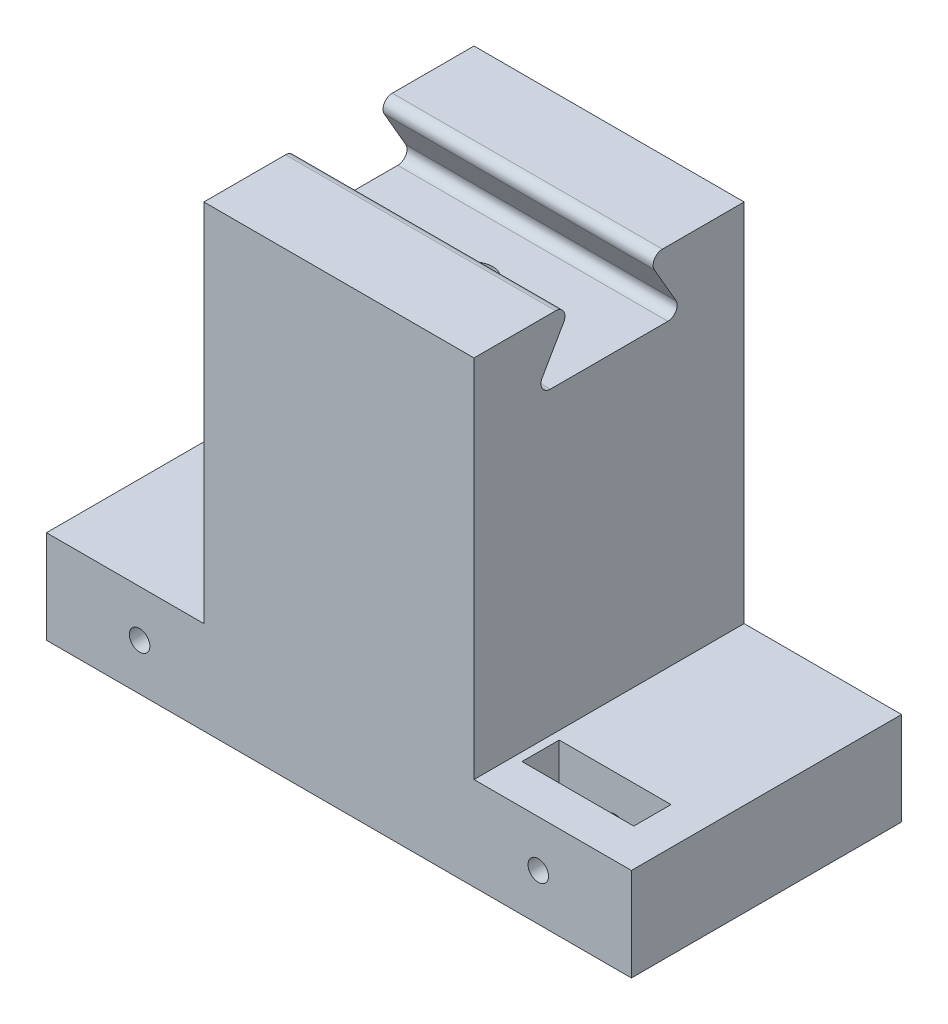
ISO-10303-21;
HEADER;
FILE_DESCRIPTION(('STEP AP214'),'2;1');
FILE_NAME('part.step','',(''),(''),'','','');
FILE_SCHEMA(('AUTOMOTIVE_DESIGN { 1 0 10303 214 1 1 1 1 }'));
ENDSEC;
DATA;
#1=APPLICATION_CONTEXT('core data for automotive mechanical design processes');
#2=APPLICATION_PROTOCOL_DEFINITION('international standard','automotive_design',2000,#1);
#3=PRODUCT_CONTEXT('',#1,'mechanical');
#4=PRODUCT('Part','Part','',(#3));
#5=PRODUCT_RELATED_PRODUCT_CATEGORY('part','',(#4));
#6=PRODUCT_DEFINITION_FORMATION('','',#4);
#7=PRODUCT_DEFINITION_CONTEXT('part definition',#1,'design');
#8=PRODUCT_DEFINITION('design','',#6,#7);
#9=PRODUCT_DEFINITION_SHAPE('','',#8);
#10=(LENGTH_UNIT() NAMED_UNIT(*) SI_UNIT(.MILLI.,.METRE.));
#11=(NAMED_UNIT(*) PLANE_ANGLE_UNIT() SI_UNIT($,.RADIAN.));
#12=(NAMED_UNIT(*) SI_UNIT($,.STERADIAN.) SOLID_ANGLE_UNIT());
#13=UNCERTAINTY_MEASURE_WITH_UNIT(LENGTH_MEASURE(1.E-05),#10,'distance_accuracy_value','');
#14=(GEOMETRIC_REPRESENTATION_CONTEXT(3) GLOBAL_UNCERTAINTY_ASSIGNED_CONTEXT((#13)) GLOBAL_UNIT_ASSIGNED_CONTEXT((#10,
#11,#12)) REPRESENTATION_CONTEXT('',''));
#15=CARTESIAN_POINT('',(0.,0.,0.));
#16=DIRECTION('',(0.,0.,1.));
#17=DIRECTION('',(1.,0.,0.));
#18=AXIS2_PLACEMENT_3D('',#15,#16,#17);
#19=CARTESIAN_POINT('',(-7.25,24.6,7.25));
#20=DIRECTION('',(1.,0.,0.));
#21=DIRECTION('',(0.,0.,-1.));
#22=AXIS2_PLACEMENT_3D('',#19,#20,#21);
#23=PLANE('',#22);
#24=DIRECTION('',(0.,0.,-1.));
#25=VECTOR('',#24,1.);
#26=CARTESIAN_POINT('',(-7.25,5.,0.));
#27=LINE('',#26,#25);
#28=CARTESIAN_POINT('',(-7.25,5.,7.25));
#29=VERTEX_POINT('',#28);
#30=CARTESIAN_POINT('',(-7.25,5.,-7.25));
#31=VERTEX_POINT('',#30);
#32=EDGE_CURVE('E278',#29,#31,#27,.T.);
#33=ORIENTED_EDGE('',*,*,#32,.F.);
#34=DIRECTION('',(0.,-1.,0.));
#35=VECTOR('',#34,1.);
#36=CARTESIAN_POINT('',(-7.25,24.6,7.25));
#37=LINE('',#36,#35);
#38=CARTESIAN_POINT('',(-7.25,24.6,7.25));
#39=VERTEX_POINT('',#38);
#40=EDGE_CURVE('E355',#39,#29,#37,.T.);
#41=ORIENTED_EDGE('',*,*,#40,.F.);
#42=DIRECTION('',(0.,0.,1.));
#43=VECTOR('',#42,1.);
#44=CARTESIAN_POINT('',(-7.25,24.6,7.25));
#45=LINE('',#44,#43);
#46=CARTESIAN_POINT('',(-7.25,24.6,2.86602540378444));
#47=VERTEX_POINT('',#46);
#48=EDGE_CURVE('E343',#47,#39,#45,.T.);
#49=ORIENTED_EDGE('',*,*,#48,.F.);
#50=CARTESIAN_POINT('',(-7.25,24.1,2.86602540378444));
#51=DIRECTION('',(1.,0.,0.));
#52=DIRECTION('',(0.,0.,-1.));
#53=AXIS2_PLACEMENT_3D('',#50,#51,#52);
#54=CIRCLE('',#53,0.5);
#55=CARTESIAN_POINT('',(-7.25,23.85,2.43301270189222));
#56=VERTEX_POINT('',#55);
#57=EDGE_CURVE('E371',#47,#56,#54,.F.);
#58=ORIENTED_EDGE('',*,*,#57,.T.);
#59=DIRECTION('',(0.,-0.86602540378444,0.499999999999998));
#60=VECTOR('',#59,1.);
#61=CARTESIAN_POINT('',(-7.25,22.3266833150659,3.31249999999999));
#62=LINE('',#61,#60);
#63=CARTESIAN_POINT('',(-7.25,21.85,3.58771324027146));
#64=VERTEX_POINT('',#63);
#65=EDGE_CURVE('E316',#56,#64,#62,.T.);
#66=ORIENTED_EDGE('',*,*,#65,.T.);
#67=CARTESIAN_POINT('',(-7.25,21.6,3.15470053837924));
#68=DIRECTION('',(1.,0.,0.));
#69=DIRECTION('',(0.,0.,-1.));
#70=AXIS2_PLACEMENT_3D('',#67,#68,#69);
#71=CIRCLE('',#70,0.5);
#72=CARTESIAN_POINT('',(-7.25,21.1,3.15470053837924));
#73=VERTEX_POINT('',#72);
#74=EDGE_CURVE('E11',#64,#73,#71,.T.);
#75=ORIENTED_EDGE('',*,*,#74,.T.);
#76=DIRECTION('',(0.,0.,-1.));
#77=VECTOR('',#76,1.);
#78=CARTESIAN_POINT('',(-7.25,21.1,7.25));
#79=LINE('',#78,#77);
#80=CARTESIAN_POINT('',(-7.25,21.1,-3.15470053837924));
#81=VERTEX_POINT('',#80);
#82=EDGE_CURVE('E321',#73,#81,#79,.T.);
#83=ORIENTED_EDGE('',*,*,#82,.T.);
#84=CARTESIAN_POINT('',(-7.25,21.6,-3.15470053837924));
#85=DIRECTION('',(1.,0.,0.));
#86=DIRECTION('',(0.,0.,-1.));
#87=AXIS2_PLACEMENT_3D('',#84,#85,#86);
#88=CIRCLE('',#87,0.5);
#89=CARTESIAN_POINT('',(-7.25,21.85,-3.58771324027146));
#90=VERTEX_POINT('',#89);
#91=EDGE_CURVE('E396',#81,#90,#88,.T.);
#92=ORIENTED_EDGE('',*,*,#91,.T.);
#93=DIRECTION('',(0.,0.86602540378444,0.499999999999998));
#94=VECTOR('',#93,1.);
#95=CARTESIAN_POINT('',(-7.25,28.605367492503,0.312499999999984));
#96=LINE('',#95,#94);
#97=CARTESIAN_POINT('',(-7.25,23.85,-2.43301270189221));
#98=VERTEX_POINT('',#97);
#99=EDGE_CURVE('E327',#90,#98,#96,.T.);
#100=ORIENTED_EDGE('',*,*,#99,.T.);
#101=CARTESIAN_POINT('',(-7.25,24.1,-2.86602540378444));
#102=DIRECTION('',(1.,0.,0.));
#103=DIRECTION('',(0.,0.,-1.));
#104=AXIS2_PLACEMENT_3D('',#101,#102,#103);
#105=CIRCLE('',#104,0.5);
#106=CARTESIAN_POINT('',(-7.25,24.6,-2.86602540378443));
#107=VERTEX_POINT('',#106);
#108=EDGE_CURVE('E369',#98,#107,#105,.F.);
#109=ORIENTED_EDGE('',*,*,#108,.T.);
#110=CARTESIAN_POINT('',(-7.25,24.6,-7.25));
#111=VERTEX_POINT('',#110);
#112=EDGE_CURVE('E344',#111,#107,#45,.T.);
#113=ORIENTED_EDGE('',*,*,#112,.F.);
#114=DIRECTION('',(0.,-1.,0.));
#115=VECTOR('',#114,1.);
#116=CARTESIAN_POINT('',(-7.25,24.6,-7.25));
#117=LINE('',#116,#115);
#118=EDGE_CURVE('E358',#111,#31,#117,.T.);
#119=ORIENTED_EDGE('',*,*,#118,.T.);
#120=EDGE_LOOP('',(#33,#41,#49,#58,#66,#75,#83,#92,#100,#109,#113,#119));
#121=FACE_BOUND('',#120,.T.);
#122=ADVANCED_FACE('F34',(#121),#23,.F.);
#123=CARTESIAN_POINT('',(0.,24.6,0.));
#124=DIRECTION('',(0.,-1.,0.));
#125=DIRECTION('',(0.,0.,-1.));
#126=AXIS2_PLACEMENT_3D('',#123,#124,#125);
#127=PLANE('',#126);
#128=ORIENTED_EDGE('',*,*,#112,.T.);
#129=DIRECTION('',(1.,0.,0.));
#130=VECTOR('',#129,1.);
#131=CARTESIAN_POINT('',(0.,24.6,-2.86602540378444));
#132=LINE('',#131,#130);
#133=CARTESIAN_POINT('',(7.25,24.6,-2.86602540378443));
#134=VERTEX_POINT('',#133);
#135=EDGE_CURVE('E381',#107,#134,#132,.T.);
#136=ORIENTED_EDGE('',*,*,#135,.T.);
#137=DIRECTION('',(0.,0.,-1.));
#138=VECTOR('',#137,1.);
#139=CARTESIAN_POINT('',(7.25,24.6,7.25));
#140=LINE('',#139,#138);
#141=CARTESIAN_POINT('',(7.25,24.6,-7.25));
#142=VERTEX_POINT('',#141);
#143=EDGE_CURVE('E341',#134,#142,#140,.T.);
#144=ORIENTED_EDGE('',*,*,#143,.T.);
#145=DIRECTION('',(-1.,0.,0.));
#146=VECTOR('',#145,1.);
#147=CARTESIAN_POINT('',(-7.25,24.6,-7.25));
#148=LINE('',#147,#146);
#149=EDGE_CURVE('E340',#142,#111,#148,.T.);
#150=ORIENTED_EDGE('',*,*,#149,.T.);
#151=EDGE_LOOP('',(#128,#136,#144,#150));
#152=FACE_BOUND('',#151,.T.);
#153=ADVANCED_FACE('F445',(#152),#127,.F.);
#154=CARTESIAN_POINT('',(7.25,24.6,7.25));
#155=DIRECTION('',(-1.,0.,0.));
#156=DIRECTION('',(0.,0.,1.));
#157=AXIS2_PLACEMENT_3D('',#154,#155,#156);
#158=PLANE('',#157);
#159=DIRECTION('',(0.,-1.,0.));
#160=VECTOR('',#159,1.);
#161=CARTESIAN_POINT('',(7.25,24.6,7.25));
#162=LINE('',#161,#160);
#163=CARTESIAN_POINT('',(7.25,24.6,7.25));
#164=VERTEX_POINT('',#163);
#165=CARTESIAN_POINT('',(7.25,5.,7.25));
#166=VERTEX_POINT('',#165);
#167=EDGE_CURVE('E349',#164,#166,#162,.T.);
#168=ORIENTED_EDGE('',*,*,#167,.T.);
#169=DIRECTION('',(0.,0.,-1.));
#170=VECTOR('',#169,1.);
#171=CARTESIAN_POINT('',(7.25,5.,0.));
#172=LINE('',#171,#170);
#173=CARTESIAN_POINT('',(7.25,5.,-7.25));
#174=VERTEX_POINT('',#173);
#175=EDGE_CURVE('E298',#166,#174,#172,.T.);
#176=ORIENTED_EDGE('',*,*,#175,.T.);
#177=DIRECTION('',(0.,-1.,0.));
#178=VECTOR('',#177,1.);
#179=CARTESIAN_POINT('',(7.25,24.6,-7.25));
#180=LINE('',#179,#178);
#181=EDGE_CURVE('E360',#142,#174,#180,.T.);
#182=ORIENTED_EDGE('',*,*,#181,.F.);
#183=ORIENTED_EDGE('',*,*,#143,.F.);
#184=CARTESIAN_POINT('',(7.25,24.1,-2.86602540378444));
#185=DIRECTION('',(-1.,0.,0.));
#186=DIRECTION('',(0.,0.,1.));
#187=AXIS2_PLACEMENT_3D('',#184,#185,#186);
#188=CIRCLE('',#187,0.5);
#189=CARTESIAN_POINT('',(7.25,23.85,-2.43301270189221));
#190=VERTEX_POINT('',#189);
#191=EDGE_CURVE('E377',#134,#190,#188,.F.);
#192=ORIENTED_EDGE('',*,*,#191,.T.);
#193=DIRECTION('',(0.,-0.86602540378444,-0.499999999999998));
#194=VECTOR('',#193,1.);
#195=CARTESIAN_POINT('',(7.25,28.605367492503,0.312499999999984));
#196=LINE('',#195,#194);
#197=CARTESIAN_POINT('',(7.25,21.85,-3.58771324027146));
#198=VERTEX_POINT('',#197);
#199=EDGE_CURVE('E330',#190,#198,#196,.T.);
#200=ORIENTED_EDGE('',*,*,#199,.T.);
#201=CARTESIAN_POINT('',(7.25,21.6,-3.15470053837924));
#202=DIRECTION('',(-1.,0.,0.));
#203=DIRECTION('',(0.,0.,1.));
#204=AXIS2_PLACEMENT_3D('',#201,#202,#203);
#205=CIRCLE('',#204,0.5);
#206=CARTESIAN_POINT('',(7.25,21.1,-3.15470053837924));
#207=VERTEX_POINT('',#206);
#208=EDGE_CURVE('E394',#198,#207,#205,.T.);
#209=ORIENTED_EDGE('',*,*,#208,.T.);
#210=DIRECTION('',(0.,0.,1.));
#211=VECTOR('',#210,1.);
#212=CARTESIAN_POINT('',(7.25,21.1,7.25));
#213=LINE('',#212,#211);
#214=CARTESIAN_POINT('',(7.25,21.1,3.15470053837924));
#215=VERTEX_POINT('',#214);
#216=EDGE_CURVE('E333',#207,#215,#213,.T.);
#217=ORIENTED_EDGE('',*,*,#216,.T.);
#218=CARTESIAN_POINT('',(7.25,21.6,3.15470053837924));
#219=DIRECTION('',(-1.,0.,0.));
#220=DIRECTION('',(0.,0.,1.));
#221=AXIS2_PLACEMENT_3D('',#218,#219,#220);
#222=CIRCLE('',#221,0.5);
#223=CARTESIAN_POINT('',(7.25,21.85,3.58771324027146));
#224=VERTEX_POINT('',#223);
#225=EDGE_CURVE('E43',#215,#224,#222,.T.);
#226=ORIENTED_EDGE('',*,*,#225,.T.);
#227=DIRECTION('',(0.,0.86602540378444,-0.499999999999998));
#228=VECTOR('',#227,1.);
#229=CARTESIAN_POINT('',(7.25,22.3266833150659,3.31249999999999));
#230=LINE('',#229,#228);
#231=CARTESIAN_POINT('',(7.25,23.85,2.43301270189222));
#232=VERTEX_POINT('',#231);
#233=EDGE_CURVE('E324',#224,#232,#230,.T.);
#234=ORIENTED_EDGE('',*,*,#233,.T.);
#235=CARTESIAN_POINT('',(7.25,24.1,2.86602540378444));
#236=DIRECTION('',(-1.,0.,0.));
#237=DIRECTION('',(0.,0.,1.));
#238=AXIS2_PLACEMENT_3D('',#235,#236,#237);
#239=CIRCLE('',#238,0.5);
#240=CARTESIAN_POINT('',(7.25,24.6,2.86602540378444));
#241=VERTEX_POINT('',#240);
#242=EDGE_CURVE('E379',#232,#241,#239,.F.);
#243=ORIENTED_EDGE('',*,*,#242,.T.);
#244=EDGE_CURVE('E337',#164,#241,#140,.T.);
#245=ORIENTED_EDGE('',*,*,#244,.F.);
#246=EDGE_LOOP('',(#168,#176,#182,#183,#192,#200,#209,#217,#226,#234,#243,#245));
#247=FACE_BOUND('',#246,.T.);
#248=ADVANCED_FACE('F451',(#247),#158,.F.);
#249=CARTESIAN_POINT('',(-7.25,24.6,-7.25));
#250=DIRECTION('',(0.,0.,1.));
#251=DIRECTION('',(1.,0.,0.));
#252=AXIS2_PLACEMENT_3D('',#249,#250,#251);
#253=PLANE('',#252);
#254=CARTESIAN_POINT('',(10.7,2.5,-7.25));
#255=DIRECTION('',(0.,0.,-1.));
#256=DIRECTION('',(-1.,0.,0.));
#257=AXIS2_PLACEMENT_3D('',#254,#255,#256);
#258=CIRCLE('',#257,0.55);
#259=CARTESIAN_POINT('',(10.15,2.5,-7.25));
#260=VERTEX_POINT('',#259);
#261=EDGE_CURVE('E418',#260,#260,#258,.T.);
#262=ORIENTED_EDGE('',*,*,#261,.F.);
#263=EDGE_LOOP('',(#262));
#264=FACE_BOUND('',#263,.T.);
#265=CARTESIAN_POINT('',(-10.7,2.5,-7.25));
#266=DIRECTION('',(0.,0.,-1.));
#267=DIRECTION('',(-1.,0.,0.));
#268=AXIS2_PLACEMENT_3D('',#265,#266,#267);
#269=CIRCLE('',#268,0.55);
#270=CARTESIAN_POINT('',(-11.25,2.5,-7.25));
#271=VERTEX_POINT('',#270);
#272=EDGE_CURVE('E412',#271,#271,#269,.T.);
#273=ORIENTED_EDGE('',*,*,#272,.F.);
#274=EDGE_LOOP('',(#273));
#275=FACE_BOUND('',#274,.T.);
#276=DIRECTION('',(-1.,0.,0.));
#277=VECTOR('',#276,1.);
#278=CARTESIAN_POINT('',(-7.25,0.,-7.25));
#279=LINE('',#278,#277);
#280=CARTESIAN_POINT('',(15.7,0.,-7.25));
#281=VERTEX_POINT('',#280);
#282=CARTESIAN_POINT('',(-15.7,0.,-7.25));
#283=VERTEX_POINT('',#282);
#284=EDGE_CURVE('E336',#281,#283,#279,.T.);
#285=ORIENTED_EDGE('',*,*,#284,.T.);
#286=DIRECTION('',(0.,-1.,0.));
#287=VECTOR('',#286,1.);
#288=CARTESIAN_POINT('',(-15.7,5.,-7.25));
#289=LINE('',#288,#287);
#290=CARTESIAN_POINT('',(-15.7,5.,-7.25));
#291=VERTEX_POINT('',#290);
#292=EDGE_CURVE('E286',#291,#283,#289,.T.);
#293=ORIENTED_EDGE('',*,*,#292,.F.);
#294=DIRECTION('',(1.,0.,0.));
#295=VECTOR('',#294,1.);
#296=CARTESIAN_POINT('',(0.,5.,-7.25));
#297=LINE('',#296,#295);
#298=EDGE_CURVE('E269',#291,#31,#297,.T.);
#299=ORIENTED_EDGE('',*,*,#298,.T.);
#300=ORIENTED_EDGE('',*,*,#118,.F.);
#301=ORIENTED_EDGE('',*,*,#149,.F.);
#302=ORIENTED_EDGE('',*,*,#181,.T.);
#303=DIRECTION('',(1.,0.,0.));
#304=VECTOR('',#303,1.);
#305=CARTESIAN_POINT('',(0.,5.,-7.25));
#306=LINE('',#305,#304);
#307=CARTESIAN_POINT('',(15.7,5.,-7.25));
#308=VERTEX_POINT('',#307);
#309=EDGE_CURVE('E295',#174,#308,#306,.T.);
#310=ORIENTED_EDGE('',*,*,#309,.T.);
#311=DIRECTION('',(0.,-1.,0.));
#312=VECTOR('',#311,1.);
#313=CARTESIAN_POINT('',(15.7,5.,-7.25));
#314=LINE('',#313,#312);
#315=EDGE_CURVE('E301',#308,#281,#314,.T.);
#316=ORIENTED_EDGE('',*,*,#315,.T.);
#317=EDGE_LOOP('',(#285,#293,#299,#300,#301,#302,#310,#316));
#318=FACE_BOUND('',#317,.T.);
#319=ADVANCED_FACE('F459',(#264,#275,#318),#253,.F.);
#320=CARTESIAN_POINT('',(-7.25,24.6,7.25));
#321=DIRECTION('',(0.,0.,-1.));
#322=DIRECTION('',(-1.,0.,0.));
#323=AXIS2_PLACEMENT_3D('',#320,#321,#322);
#324=PLANE('',#323);
#325=CARTESIAN_POINT('',(10.7,2.5,7.25));
#326=DIRECTION('',(0.,0.,-1.));
#327=DIRECTION('',(-1.,0.,0.));
#328=AXIS2_PLACEMENT_3D('',#325,#326,#327);
#329=CIRCLE('',#328,0.55);
#330=CARTESIAN_POINT('',(10.15,2.5,7.25));
#331=VERTEX_POINT('',#330);
#332=EDGE_CURVE('E402',#331,#331,#329,.T.);
#333=ORIENTED_EDGE('',*,*,#332,.T.);
#334=EDGE_LOOP('',(#333));
#335=FACE_BOUND('',#334,.T.);
#336=CARTESIAN_POINT('',(-10.7,2.5,7.25));
#337=DIRECTION('',(0.,0.,-1.));
#338=DIRECTION('',(-1.,0.,0.));
#339=AXIS2_PLACEMENT_3D('',#336,#337,#338);
#340=CIRCLE('',#339,0.55);
#341=CARTESIAN_POINT('',(-11.25,2.5,7.25));
#342=VERTEX_POINT('',#341);
#343=EDGE_CURVE('E415',#342,#342,#340,.T.);
#344=ORIENTED_EDGE('',*,*,#343,.T.);
#345=EDGE_LOOP('',(#344));
#346=FACE_BOUND('',#345,.T.);
#347=DIRECTION('',(1.,0.,0.));
#348=VECTOR('',#347,1.);
#349=CARTESIAN_POINT('',(-7.25,0.,7.25));
#350=LINE('',#349,#348);
#351=CARTESIAN_POINT('',(-15.7,0.,7.25));
#352=VERTEX_POINT('',#351);
#353=CARTESIAN_POINT('',(15.7,0.,7.25));
#354=VERTEX_POINT('',#353);
#355=EDGE_CURVE('E351',#352,#354,#350,.T.);
#356=ORIENTED_EDGE('',*,*,#355,.T.);
#357=DIRECTION('',(0.,-1.,0.));
#358=VECTOR('',#357,1.);
#359=CARTESIAN_POINT('',(15.7,5.,7.25));
#360=LINE('',#359,#358);
#361=CARTESIAN_POINT('',(15.7,5.,7.25));
#362=VERTEX_POINT('',#361);
#363=EDGE_CURVE('E306',#362,#354,#360,.T.);
#364=ORIENTED_EDGE('',*,*,#363,.F.);
#365=DIRECTION('',(1.,0.,0.));
#366=VECTOR('',#365,1.);
#367=CARTESIAN_POINT('',(0.,5.,7.25));
#368=LINE('',#367,#366);
#369=EDGE_CURVE('E290',#166,#362,#368,.T.);
#370=ORIENTED_EDGE('',*,*,#369,.F.);
#371=ORIENTED_EDGE('',*,*,#167,.F.);
#372=DIRECTION('',(1.,0.,0.));
#373=VECTOR('',#372,1.);
#374=CARTESIAN_POINT('',(-7.25,24.6,7.25));
#375=LINE('',#374,#373);
#376=EDGE_CURVE('E347',#39,#164,#375,.T.);
#377=ORIENTED_EDGE('',*,*,#376,.F.);
#378=ORIENTED_EDGE('',*,*,#40,.T.);
#379=DIRECTION('',(1.,0.,0.));
#380=VECTOR('',#379,1.);
#381=CARTESIAN_POINT('',(0.,5.,7.25));
#382=LINE('',#381,#380);
#383=CARTESIAN_POINT('',(-15.7,5.,7.25));
#384=VERTEX_POINT('',#383);
#385=EDGE_CURVE('E275',#384,#29,#382,.T.);
#386=ORIENTED_EDGE('',*,*,#385,.F.);
#387=DIRECTION('',(0.,-1.,0.));
#388=VECTOR('',#387,1.);
#389=CARTESIAN_POINT('',(-15.7,5.,7.25));
#390=LINE('',#389,#388);
#391=EDGE_CURVE('E281',#384,#352,#390,.T.);
#392=ORIENTED_EDGE('',*,*,#391,.T.);
#393=EDGE_LOOP('',(#356,#364,#370,#371,#377,#378,#386,#392));
#394=FACE_BOUND('',#393,.T.);
#395=ADVANCED_FACE('F457',(#335,#346,#394),#324,.F.);
#396=ORIENTED_EDGE('',*,*,#244,.T.);
#397=DIRECTION('',(-1.,0.,0.));
#398=VECTOR('',#397,1.);
#399=CARTESIAN_POINT('',(0.,24.6,2.86602540378444));
#400=LINE('',#399,#398);
#401=EDGE_CURVE('E320',#241,#47,#400,.T.);
#402=ORIENTED_EDGE('',*,*,#401,.T.);
#403=ORIENTED_EDGE('',*,*,#48,.T.);
#404=ORIENTED_EDGE('',*,*,#376,.T.);
#405=EDGE_LOOP('',(#396,#402,#403,#404));
#406=FACE_BOUND('',#405,.T.);
#407=ADVANCED_FACE('F454',(#406),#127,.F.);
#408=CARTESIAN_POINT('',(0.,0.,0.));
#409=DIRECTION('',(0.,-1.,0.));
#410=DIRECTION('',(0.,0.,-1.));
#411=AXIS2_PLACEMENT_3D('',#408,#409,#410);
#412=PLANE('',#411);
#413=DIRECTION('',(0.,0.,-1.));
#414=VECTOR('',#413,1.);
#415=CARTESIAN_POINT('',(7.69999999999999,0.,3.125));
#416=LINE('',#415,#414);
#417=CARTESIAN_POINT('',(7.69999999999999,0.,5.125));
#418=VERTEX_POINT('',#417);
#419=CARTESIAN_POINT('',(7.69999999999999,0.,3.125));
#420=VERTEX_POINT('',#419);
#421=EDGE_CURVE('E51',#418,#420,#416,.T.);
#422=ORIENTED_EDGE('',*,*,#421,.F.);
#423=DIRECTION('',(-1.,0.,0.));
#424=VECTOR('',#423,1.);
#425=CARTESIAN_POINT('',(13.7,0.,5.125));
#426=LINE('',#425,#424);
#427=CARTESIAN_POINT('',(13.7,0.,5.125));
#428=VERTEX_POINT('',#427);
#429=EDGE_CURVE('E217',#428,#418,#426,.T.);
#430=ORIENTED_EDGE('',*,*,#429,.F.);
#431=DIRECTION('',(0.,0.,1.));
#432=VECTOR('',#431,1.);
#433=CARTESIAN_POINT('',(13.7,0.,3.125));
#434=LINE('',#433,#432);
#435=CARTESIAN_POINT('',(13.7,0.,3.125));
#436=VERTEX_POINT('',#435);
#437=EDGE_CURVE('E220',#436,#428,#434,.T.);
#438=ORIENTED_EDGE('',*,*,#437,.F.);
#439=DIRECTION('',(1.,0.,0.));
#440=VECTOR('',#439,1.);
#441=CARTESIAN_POINT('',(13.7,0.,3.125));
#442=LINE('',#441,#440);
#443=EDGE_CURVE('E229',#420,#436,#442,.T.);
#444=ORIENTED_EDGE('',*,*,#443,.F.);
#445=EDGE_LOOP('',(#422,#430,#438,#444));
#446=FACE_BOUND('',#445,.T.);
#447=DIRECTION('',(0.,0.,-1.));
#448=VECTOR('',#447,1.);
#449=CARTESIAN_POINT('',(-13.7,0.,-5.125));
#450=LINE('',#449,#448);
#451=CARTESIAN_POINT('',(-13.7,0.,-3.125));
#452=VERTEX_POINT('',#451);
#453=CARTESIAN_POINT('',(-13.7,0.,-5.125));
#454=VERTEX_POINT('',#453);
#455=EDGE_CURVE('E59',#452,#454,#450,.T.);
#456=ORIENTED_EDGE('',*,*,#455,.F.);
#457=DIRECTION('',(-1.,0.,0.));
#458=VECTOR('',#457,1.);
#459=CARTESIAN_POINT('',(-7.7,0.,-3.125));
#460=LINE('',#459,#458);
#461=CARTESIAN_POINT('',(-7.7,0.,-3.125));
#462=VERTEX_POINT('',#461);
#463=EDGE_CURVE('E244',#462,#452,#460,.T.);
#464=ORIENTED_EDGE('',*,*,#463,.F.);
#465=DIRECTION('',(0.,0.,1.));
#466=VECTOR('',#465,1.);
#467=CARTESIAN_POINT('',(-7.7,0.,-5.125));
#468=LINE('',#467,#466);
#469=CARTESIAN_POINT('',(-7.7,0.,-5.125));
#470=VERTEX_POINT('',#469);
#471=EDGE_CURVE('E258',#470,#462,#468,.T.);
#472=ORIENTED_EDGE('',*,*,#471,.F.);
#473=DIRECTION('',(1.,0.,0.));
#474=VECTOR('',#473,1.);
#475=CARTESIAN_POINT('',(-7.7,0.,-5.125));
#476=LINE('',#475,#474);
#477=EDGE_CURVE('E255',#454,#470,#476,.T.);
#478=ORIENTED_EDGE('',*,*,#477,.F.);
#479=EDGE_LOOP('',(#456,#464,#472,#478));
#480=FACE_BOUND('',#479,.T.);
#481=CARTESIAN_POINT('',(0.,0.,0.));
#482=DIRECTION('',(0.,-1.,0.));
#483=DIRECTION('',(0.,0.,-1.));
#484=AXIS2_PLACEMENT_3D('',#481,#482,#483);
#485=CIRCLE('',#484,4.);
#486=CARTESIAN_POINT('',(0.,0.,-4.));
#487=VERTEX_POINT('',#486);
#488=EDGE_CURVE('E317',#487,#487,#485,.T.);
#489=ORIENTED_EDGE('',*,*,#488,.F.);
#490=EDGE_LOOP('',(#489));
#491=FACE_BOUND('',#490,.T.);
#492=ORIENTED_EDGE('',*,*,#284,.F.);
#493=DIRECTION('',(0.,0.,-1.));
#494=VECTOR('',#493,1.);
#495=CARTESIAN_POINT('',(15.7,0.,0.));
#496=LINE('',#495,#494);
#497=EDGE_CURVE('E289',#354,#281,#496,.T.);
#498=ORIENTED_EDGE('',*,*,#497,.F.);
#499=ORIENTED_EDGE('',*,*,#355,.F.);
#500=DIRECTION('',(0.,0.,-1.));
#501=VECTOR('',#500,1.);
#502=CARTESIAN_POINT('',(-15.7,0.,0.));
#503=LINE('',#502,#501);
#504=EDGE_CURVE('E236',#352,#283,#503,.T.);
#505=ORIENTED_EDGE('',*,*,#504,.T.);
#506=EDGE_LOOP('',(#492,#498,#499,#505));
#507=FACE_BOUND('',#506,.T.);
#508=ADVANCED_FACE('F526',(#446,#480,#491,#507),#412,.T.);
#509=CARTESIAN_POINT('',(-10.,21.1,-4.02072594216368));
#510=DIRECTION('',(0.,-1.,0.));
#511=DIRECTION('',(0.,0.,-1.));
#512=AXIS2_PLACEMENT_3D('',#509,#510,#511);
#513=PLANE('',#512);
#514=CARTESIAN_POINT('',(0.,21.1,0.));
#515=DIRECTION('',(0.,1.,0.));
#516=DIRECTION('',(0.,0.,1.));
#517=AXIS2_PLACEMENT_3D('',#514,#515,#516);
#518=CIRCLE('',#517,1.);
#519=CARTESIAN_POINT('',(0.,21.1,1.));
#520=VERTEX_POINT('',#519);
#521=EDGE_CURVE('E423',#520,#520,#518,.T.);
#522=ORIENTED_EDGE('',*,*,#521,.F.);
#523=EDGE_LOOP('',(#522));
#524=FACE_BOUND('',#523,.T.);
#525=ORIENTED_EDGE('',*,*,#216,.F.);
#526=DIRECTION('',(1.,0.,0.));
#527=VECTOR('',#526,1.);
#528=CARTESIAN_POINT('',(-7.25,21.1,-3.15470053837924));
#529=LINE('',#528,#527);
#530=EDGE_CURVE('E392',#207,#81,#529,.F.);
#531=ORIENTED_EDGE('',*,*,#530,.T.);
#532=ORIENTED_EDGE('',*,*,#82,.F.);
#533=DIRECTION('',(1.,0.,0.));
#534=VECTOR('',#533,1.);
#535=CARTESIAN_POINT('',(7.25,21.1,3.15470053837924));
#536=LINE('',#535,#534);
#537=EDGE_CURVE('E389',#73,#215,#536,.T.);
#538=ORIENTED_EDGE('',*,*,#537,.T.);
#539=EDGE_LOOP('',(#525,#531,#532,#538));
#540=FACE_BOUND('',#539,.T.);
#541=ADVANCED_FACE('F524',(#524,#540),#513,.F.);
#542=CARTESIAN_POINT('',(-10.,24.6,-2.));
#543=DIRECTION('',(0.,0.499999999999998,-0.86602540378444));
#544=DIRECTION('',(0.,0.86602540378444,0.499999999999998));
#545=AXIS2_PLACEMENT_3D('',#542,#543,#544);
#546=PLANE('',#545);
#547=ORIENTED_EDGE('',*,*,#199,.F.);
#548=DIRECTION('',(1.,0.,0.));
#549=VECTOR('',#548,1.);
#550=CARTESIAN_POINT('',(-10.,23.85,-2.43301270189222));
#551=LINE('',#550,#549);
#552=EDGE_CURVE('E387',#190,#98,#551,.F.);
#553=ORIENTED_EDGE('',*,*,#552,.T.);
#554=ORIENTED_EDGE('',*,*,#99,.F.);
#555=DIRECTION('',(1.,0.,0.));
#556=VECTOR('',#555,1.);
#557=CARTESIAN_POINT('',(7.25,21.85,-3.58771324027146));
#558=LINE('',#557,#556);
#559=EDGE_CURVE('E384',#90,#198,#558,.T.);
#560=ORIENTED_EDGE('',*,*,#559,.T.);
#561=EDGE_LOOP('',(#547,#553,#554,#560));
#562=FACE_BOUND('',#561,.T.);
#563=ADVANCED_FACE('F490',(#562),#546,.F.);
#564=CARTESIAN_POINT('',(-10.,24.6,2.));
#565=DIRECTION('',(0.,0.499999999999998,0.86602540378444));
#566=DIRECTION('',(0.,-0.86602540378444,0.499999999999998));
#567=AXIS2_PLACEMENT_3D('',#564,#565,#566);
#568=PLANE('',#567);
#569=ORIENTED_EDGE('',*,*,#65,.F.);
#570=DIRECTION('',(-1.,0.,0.));
#571=VECTOR('',#570,1.);
#572=CARTESIAN_POINT('',(-10.,23.85,2.43301270189222));
#573=LINE('',#572,#571);
#574=EDGE_CURVE('E375',#56,#232,#573,.F.);
#575=ORIENTED_EDGE('',*,*,#574,.T.);
#576=ORIENTED_EDGE('',*,*,#233,.F.);
#577=DIRECTION('',(1.,0.,0.));
#578=VECTOR('',#577,1.);
#579=CARTESIAN_POINT('',(-7.25,21.85,3.58771324027146));
#580=LINE('',#579,#578);
#581=EDGE_CURVE('E373',#224,#64,#580,.F.);
#582=ORIENTED_EDGE('',*,*,#581,.T.);
#583=EDGE_LOOP('',(#569,#575,#576,#582));
#584=FACE_BOUND('',#583,.T.);
#585=ADVANCED_FACE('F518',(#584),#568,.F.);
#586=CARTESIAN_POINT('',(0.,-2.,0.));
#587=DIRECTION('',(0.,1.,0.));
#588=DIRECTION('',(0.,0.,1.));
#589=AXIS2_PLACEMENT_3D('',#586,#587,#588);
#590=CYLINDRICAL_SURFACE('',#589,4.);
#591=CARTESIAN_POINT('',(0.,-2.,0.));
#592=DIRECTION('',(0.,-1.,0.));
#593=DIRECTION('',(0.,0.,-1.));
#594=AXIS2_PLACEMENT_3D('',#591,#592,#593);
#595=CIRCLE('',#594,4.);
#596=CARTESIAN_POINT('',(0.,-2.,-4.));
#597=VERTEX_POINT('',#596);
#598=EDGE_CURVE('E313',#597,#597,#595,.T.);
#599=ORIENTED_EDGE('',*,*,#598,.F.);
#600=EDGE_LOOP('',(#599));
#601=FACE_BOUND('',#600,.T.);
#602=ORIENTED_EDGE('',*,*,#488,.T.);
#603=EDGE_LOOP('',(#602));
#604=FACE_BOUND('',#603,.T.);
#605=ADVANCED_FACE('F537',(#601,#604),#590,.T.);
#606=CARTESIAN_POINT('',(0.,-2.,0.));
#607=DIRECTION('',(0.,-1.,0.));
#608=DIRECTION('',(0.,0.,-1.));
#609=AXIS2_PLACEMENT_3D('',#606,#607,#608);
#610=PLANE('',#609);
#611=CARTESIAN_POINT('',(0.,-2.,0.));
#612=DIRECTION('',(0.,-1.,0.));
#613=DIRECTION('',(0.,0.,-1.));
#614=AXIS2_PLACEMENT_3D('',#611,#612,#613);
#615=CIRCLE('',#614,3.302);
#616=CARTESIAN_POINT('',(0.,-2.,-3.302));
#617=VERTEX_POINT('',#616);
#618=EDGE_CURVE('E312',#617,#617,#615,.T.);
#619=ORIENTED_EDGE('',*,*,#618,.F.);
#620=EDGE_LOOP('',(#619));
#621=FACE_BOUND('',#620,.T.);
#622=ORIENTED_EDGE('',*,*,#598,.T.);
#623=EDGE_LOOP('',(#622));
#624=FACE_BOUND('',#623,.T.);
#625=ADVANCED_FACE('F597',(#621,#624),#610,.T.);
#626=CARTESIAN_POINT('',(0.,0.,0.));
#627=DIRECTION('',(0.,-1.,0.));
#628=DIRECTION('',(0.,0.,-1.));
#629=AXIS2_PLACEMENT_3D('',#626,#627,#628);
#630=SPHERICAL_SURFACE('',#629,3.302);
#631=CARTESIAN_POINT('',(0.,3.14693565234499,0.));
#632=DIRECTION('',(0.,-1.,0.));
#633=DIRECTION('',(0.,0.,-1.));
#634=AXIS2_PLACEMENT_3D('',#631,#632,#633);
#635=CIRCLE('',#634,1.);
#636=CARTESIAN_POINT('',(0.,3.14693565234499,-1.));
#637=VERTEX_POINT('',#636);
#638=EDGE_CURVE('E38',#637,#637,#635,.F.);
#639=ORIENTED_EDGE('',*,*,#638,.T.);
#640=EDGE_LOOP('',(#639));
#641=FACE_BOUND('',#640,.T.);
#642=CARTESIAN_POINT('',(0.,0.,0.));
#643=DIRECTION('',(0.,-1.,0.));
#644=DIRECTION('',(0.,0.,-1.));
#645=AXIS2_PLACEMENT_3D('',#642,#643,#644);
#646=CIRCLE('',#645,3.302);
#647=CARTESIAN_POINT('',(0.,0.,-3.302));
#648=VERTEX_POINT('',#647);
#649=EDGE_CURVE('E309',#648,#648,#646,.T.);
#650=ORIENTED_EDGE('',*,*,#649,.T.);
#651=EDGE_LOOP('',(#650));
#652=FACE_BOUND('',#651,.T.);
#653=ADVANCED_FACE('F430',(#641,#652),#630,.F.);
#654=CARTESIAN_POINT('',(0.,0.,0.));
#655=DIRECTION('',(0.,-1.,0.));
#656=DIRECTION('',(0.,0.,-1.));
#657=AXIS2_PLACEMENT_3D('',#654,#655,#656);
#658=CYLINDRICAL_SURFACE('',#657,3.302);
#659=ORIENTED_EDGE('',*,*,#618,.T.);
#660=EDGE_LOOP('',(#659));
#661=FACE_BOUND('',#660,.T.);
#662=ORIENTED_EDGE('',*,*,#649,.F.);
#663=EDGE_LOOP('',(#662));
#664=FACE_BOUND('',#663,.T.);
#665=ADVANCED_FACE('F470',(#661,#664),#658,.F.);
#666=CARTESIAN_POINT('',(0.,24.1,2.86602540378444));
#667=DIRECTION('',(-1.,0.,0.));
#668=DIRECTION('',(0.,0.,1.));
#669=AXIS2_PLACEMENT_3D('',#666,#667,#668);
#670=CYLINDRICAL_SURFACE('',#669,0.5);
#671=ORIENTED_EDGE('',*,*,#242,.F.);
#672=ORIENTED_EDGE('',*,*,#574,.F.);
#673=ORIENTED_EDGE('',*,*,#57,.F.);
#674=ORIENTED_EDGE('',*,*,#401,.F.);
#675=EDGE_LOOP('',(#671,#672,#673,#674));
#676=FACE_BOUND('',#675,.T.);
#677=ADVANCED_FACE('F466',(#676),#670,.T.);
#678=CARTESIAN_POINT('',(0.,24.1,-2.86602540378444));
#679=DIRECTION('',(1.,0.,0.));
#680=DIRECTION('',(0.,0.,-1.));
#681=AXIS2_PLACEMENT_3D('',#678,#679,#680);
#682=CYLINDRICAL_SURFACE('',#681,0.5);
#683=ORIENTED_EDGE('',*,*,#108,.F.);
#684=ORIENTED_EDGE('',*,*,#552,.F.);
#685=ORIENTED_EDGE('',*,*,#191,.F.);
#686=ORIENTED_EDGE('',*,*,#135,.F.);
#687=EDGE_LOOP('',(#683,#684,#685,#686));
#688=FACE_BOUND('',#687,.T.);
#689=ADVANCED_FACE('F469',(#688),#682,.T.);
#690=CARTESIAN_POINT('',(-10.,21.6,-3.15470053837924));
#691=DIRECTION('',(-1.,0.,0.));
#692=DIRECTION('',(0.,0.,1.));
#693=AXIS2_PLACEMENT_3D('',#690,#691,#692);
#694=CYLINDRICAL_SURFACE('',#693,0.5);
#695=ORIENTED_EDGE('',*,*,#91,.F.);
#696=ORIENTED_EDGE('',*,*,#530,.F.);
#697=ORIENTED_EDGE('',*,*,#208,.F.);
#698=ORIENTED_EDGE('',*,*,#559,.F.);
#699=EDGE_LOOP('',(#695,#696,#697,#698));
#700=FACE_BOUND('',#699,.T.);
#701=ADVANCED_FACE('F473',(#700),#694,.F.);
#702=CARTESIAN_POINT('',(-10.,21.6,3.15470053837924));
#703=DIRECTION('',(-1.,0.,0.));
#704=DIRECTION('',(0.,0.,1.));
#705=AXIS2_PLACEMENT_3D('',#702,#703,#704);
#706=CYLINDRICAL_SURFACE('',#705,0.5);
#707=ORIENTED_EDGE('',*,*,#74,.F.);
#708=ORIENTED_EDGE('',*,*,#581,.F.);
#709=ORIENTED_EDGE('',*,*,#225,.F.);
#710=ORIENTED_EDGE('',*,*,#537,.F.);
#711=EDGE_LOOP('',(#707,#708,#709,#710));
#712=FACE_BOUND('',#711,.T.);
#713=ADVANCED_FACE('F36',(#712),#706,.F.);
#714=CARTESIAN_POINT('',(15.7,5.,0.));
#715=DIRECTION('',(-1.,0.,0.));
#716=DIRECTION('',(0.,0.,1.));
#717=AXIS2_PLACEMENT_3D('',#714,#715,#716);
#718=PLANE('',#717);
#719=ORIENTED_EDGE('',*,*,#497,.T.);
#720=ORIENTED_EDGE('',*,*,#315,.F.);
#721=DIRECTION('',(0.,0.,-1.));
#722=VECTOR('',#721,1.);
#723=CARTESIAN_POINT('',(15.7,5.,0.));
#724=LINE('',#723,#722);
#725=EDGE_CURVE('E293',#362,#308,#724,.T.);
#726=ORIENTED_EDGE('',*,*,#725,.F.);
#727=ORIENTED_EDGE('',*,*,#363,.T.);
#728=EDGE_LOOP('',(#719,#720,#726,#727));
#729=FACE_BOUND('',#728,.T.);
#730=ADVANCED_FACE('F480',(#729),#718,.F.);
#731=CARTESIAN_POINT('',(0.,5.,0.));
#732=DIRECTION('',(0.,1.,0.));
#733=DIRECTION('',(0.,0.,1.));
#734=AXIS2_PLACEMENT_3D('',#731,#732,#733);
#735=PLANE('',#734);
#736=DIRECTION('',(0.,0.,-1.));
#737=VECTOR('',#736,1.);
#738=CARTESIAN_POINT('',(7.69999999999999,5.,3.125));
#739=LINE('',#738,#737);
#740=CARTESIAN_POINT('',(7.69999999999999,5.,5.125));
#741=VERTEX_POINT('',#740);
#742=CARTESIAN_POINT('',(7.69999999999999,5.,3.125));
#743=VERTEX_POINT('',#742);
#744=EDGE_CURVE('E198',#741,#743,#739,.T.);
#745=ORIENTED_EDGE('',*,*,#744,.T.);
#746=DIRECTION('',(1.,0.,0.));
#747=VECTOR('',#746,1.);
#748=CARTESIAN_POINT('',(13.7,5.,3.125));
#749=LINE('',#748,#747);
#750=CARTESIAN_POINT('',(13.7,5.,3.125));
#751=VERTEX_POINT('',#750);
#752=EDGE_CURVE('E208',#743,#751,#749,.T.);
#753=ORIENTED_EDGE('',*,*,#752,.T.);
#754=DIRECTION('',(0.,0.,1.));
#755=VECTOR('',#754,1.);
#756=CARTESIAN_POINT('',(13.7,5.,3.125));
#757=LINE('',#756,#755);
#758=CARTESIAN_POINT('',(13.7,5.,5.125));
#759=VERTEX_POINT('',#758);
#760=EDGE_CURVE('E212',#751,#759,#757,.T.);
#761=ORIENTED_EDGE('',*,*,#760,.T.);
#762=DIRECTION('',(-1.,0.,0.));
#763=VECTOR('',#762,1.);
#764=CARTESIAN_POINT('',(13.7,5.,5.125));
#765=LINE('',#764,#763);
#766=EDGE_CURVE('E204',#759,#741,#765,.T.);
#767=ORIENTED_EDGE('',*,*,#766,.T.);
#768=EDGE_LOOP('',(#745,#753,#761,#767));
#769=FACE_BOUND('',#768,.T.);
#770=ORIENTED_EDGE('',*,*,#369,.T.);
#771=ORIENTED_EDGE('',*,*,#725,.T.);
#772=ORIENTED_EDGE('',*,*,#309,.F.);
#773=ORIENTED_EDGE('',*,*,#175,.F.);
#774=EDGE_LOOP('',(#770,#771,#772,#773));
#775=FACE_BOUND('',#774,.T.);
#776=ADVANCED_FACE('F214',(#769,#775),#735,.T.);
#777=CARTESIAN_POINT('',(-15.7,5.,0.));
#778=DIRECTION('',(-1.,0.,0.));
#779=DIRECTION('',(0.,0.,1.));
#780=AXIS2_PLACEMENT_3D('',#777,#778,#779);
#781=PLANE('',#780);
#782=ORIENTED_EDGE('',*,*,#504,.F.);
#783=ORIENTED_EDGE('',*,*,#391,.F.);
#784=DIRECTION('',(0.,0.,-1.));
#785=VECTOR('',#784,1.);
#786=CARTESIAN_POINT('',(-15.7,5.,0.));
#787=LINE('',#786,#785);
#788=EDGE_CURVE('E272',#384,#291,#787,.T.);
#789=ORIENTED_EDGE('',*,*,#788,.T.);
#790=ORIENTED_EDGE('',*,*,#292,.T.);
#791=EDGE_LOOP('',(#782,#783,#789,#790));
#792=FACE_BOUND('',#791,.T.);
#793=ADVANCED_FACE('F584',(#792),#781,.T.);
#794=CARTESIAN_POINT('',(0.,5.,0.));
#795=DIRECTION('',(0.,1.,0.));
#796=DIRECTION('',(0.,0.,1.));
#797=AXIS2_PLACEMENT_3D('',#794,#795,#796);
#798=PLANE('',#797);
#799=DIRECTION('',(0.,0.,-1.));
#800=VECTOR('',#799,1.);
#801=CARTESIAN_POINT('',(-13.7,5.,-5.125));
#802=LINE('',#801,#800);
#803=CARTESIAN_POINT('',(-13.7,5.,-3.125));
#804=VERTEX_POINT('',#803);
#805=CARTESIAN_POINT('',(-13.7,5.,-5.125));
#806=VERTEX_POINT('',#805);
#807=EDGE_CURVE('E240',#804,#806,#802,.T.);
#808=ORIENTED_EDGE('',*,*,#807,.T.);
#809=DIRECTION('',(1.,0.,0.));
#810=VECTOR('',#809,1.);
#811=CARTESIAN_POINT('',(-7.7,5.,-5.125));
#812=LINE('',#811,#810);
#813=CARTESIAN_POINT('',(-7.7,5.,-5.125));
#814=VERTEX_POINT('',#813);
#815=EDGE_CURVE('E243',#806,#814,#812,.T.);
#816=ORIENTED_EDGE('',*,*,#815,.T.);
#817=DIRECTION('',(0.,0.,1.));
#818=VECTOR('',#817,1.);
#819=CARTESIAN_POINT('',(-7.7,5.,-5.125));
#820=LINE('',#819,#818);
#821=CARTESIAN_POINT('',(-7.7,5.,-3.125));
#822=VERTEX_POINT('',#821);
#823=EDGE_CURVE('E247',#814,#822,#820,.T.);
#824=ORIENTED_EDGE('',*,*,#823,.T.);
#825=DIRECTION('',(-1.,0.,0.));
#826=VECTOR('',#825,1.);
#827=CARTESIAN_POINT('',(-7.7,5.,-3.125));
#828=LINE('',#827,#826);
#829=EDGE_CURVE('E250',#822,#804,#828,.T.);
#830=ORIENTED_EDGE('',*,*,#829,.T.);
#831=EDGE_LOOP('',(#808,#816,#824,#830));
#832=FACE_BOUND('',#831,.T.);
#833=ORIENTED_EDGE('',*,*,#298,.F.);
#834=ORIENTED_EDGE('',*,*,#788,.F.);
#835=ORIENTED_EDGE('',*,*,#385,.T.);
#836=ORIENTED_EDGE('',*,*,#32,.T.);
#837=EDGE_LOOP('',(#833,#834,#835,#836));
#838=FACE_BOUND('',#837,.T.);
#839=ADVANCED_FACE('F502',(#832,#838),#798,.T.);
#840=CARTESIAN_POINT('',(-13.7,5.,-5.125));
#841=DIRECTION('',(-1.,0.,0.));
#842=DIRECTION('',(0.,0.,1.));
#843=AXIS2_PLACEMENT_3D('',#840,#841,#842);
#844=PLANE('',#843);
#845=ORIENTED_EDGE('',*,*,#455,.T.);
#846=DIRECTION('',(0.,-1.,0.));
#847=VECTOR('',#846,1.);
#848=CARTESIAN_POINT('',(-13.7,5.,-5.125));
#849=LINE('',#848,#847);
#850=EDGE_CURVE('E253',#806,#454,#849,.T.);
#851=ORIENTED_EDGE('',*,*,#850,.F.);
#852=ORIENTED_EDGE('',*,*,#807,.F.);
#853=DIRECTION('',(0.,-1.,0.));
#854=VECTOR('',#853,1.);
#855=CARTESIAN_POINT('',(-13.7,5.,-3.125));
#856=LINE('',#855,#854);
#857=EDGE_CURVE('E230',#804,#452,#856,.T.);
#858=ORIENTED_EDGE('',*,*,#857,.T.);
#859=EDGE_LOOP('',(#845,#851,#852,#858));
#860=FACE_BOUND('',#859,.T.);
#861=ADVANCED_FACE('F557',(#860),#844,.F.);
#862=CARTESIAN_POINT('',(-7.7,5.,-3.125));
#863=DIRECTION('',(0.,0.,1.));
#864=DIRECTION('',(1.,0.,0.));
#865=AXIS2_PLACEMENT_3D('',#862,#863,#864);
#866=PLANE('',#865);
#867=CARTESIAN_POINT('',(-10.7,2.5,-3.125));
#868=DIRECTION('',(0.,0.,1.));
#869=DIRECTION('',(1.,0.,0.));
#870=AXIS2_PLACEMENT_3D('',#867,#868,#869);
#871=CIRCLE('',#870,0.55);
#872=CARTESIAN_POINT('',(-10.15,2.5,-3.125));
#873=VERTEX_POINT('',#872);
#874=EDGE_CURVE('E223',#873,#873,#871,.T.);
#875=ORIENTED_EDGE('',*,*,#874,.T.);
#876=EDGE_LOOP('',(#875));
#877=FACE_BOUND('',#876,.T.);
#878=ORIENTED_EDGE('',*,*,#463,.T.);
#879=ORIENTED_EDGE('',*,*,#857,.F.);
#880=ORIENTED_EDGE('',*,*,#829,.F.);
#881=DIRECTION('',(0.,-1.,0.));
#882=VECTOR('',#881,1.);
#883=CARTESIAN_POINT('',(-7.7,5.,-3.125));
#884=LINE('',#883,#882);
#885=EDGE_CURVE('E264',#822,#462,#884,.T.);
#886=ORIENTED_EDGE('',*,*,#885,.T.);
#887=EDGE_LOOP('',(#878,#879,#880,#886));
#888=FACE_BOUND('',#887,.T.);
#889=ADVANCED_FACE('F553',(#877,#888),#866,.F.);
#890=CARTESIAN_POINT('',(-7.7,5.,-5.125));
#891=DIRECTION('',(1.,0.,0.));
#892=DIRECTION('',(0.,0.,-1.));
#893=AXIS2_PLACEMENT_3D('',#890,#891,#892);
#894=PLANE('',#893);
#895=ORIENTED_EDGE('',*,*,#471,.T.);
#896=ORIENTED_EDGE('',*,*,#885,.F.);
#897=ORIENTED_EDGE('',*,*,#823,.F.);
#898=DIRECTION('',(0.,-1.,0.));
#899=VECTOR('',#898,1.);
#900=CARTESIAN_POINT('',(-7.7,5.,-5.125));
#901=LINE('',#900,#899);
#902=EDGE_CURVE('E266',#814,#470,#901,.T.);
#903=ORIENTED_EDGE('',*,*,#902,.T.);
#904=EDGE_LOOP('',(#895,#896,#897,#903));
#905=FACE_BOUND('',#904,.T.);
#906=ADVANCED_FACE('F556',(#905),#894,.F.);
#907=CARTESIAN_POINT('',(-7.7,5.,-5.125));
#908=DIRECTION('',(0.,0.,-1.));
#909=DIRECTION('',(-1.,0.,0.));
#910=AXIS2_PLACEMENT_3D('',#907,#908,#909);
#911=PLANE('',#910);
#912=CARTESIAN_POINT('',(-10.7,2.5,-5.125));
#913=DIRECTION('',(0.,0.,-1.));
#914=DIRECTION('',(-1.,0.,0.));
#915=AXIS2_PLACEMENT_3D('',#912,#913,#914);
#916=CIRCLE('',#915,0.55);
#917=CARTESIAN_POINT('',(-11.25,2.5,-5.125));
#918=VERTEX_POINT('',#917);
#919=EDGE_CURVE('E403',#918,#918,#916,.T.);
#920=ORIENTED_EDGE('',*,*,#919,.T.);
#921=EDGE_LOOP('',(#920));
#922=FACE_BOUND('',#921,.T.);
#923=ORIENTED_EDGE('',*,*,#477,.T.);
#924=ORIENTED_EDGE('',*,*,#902,.F.);
#925=ORIENTED_EDGE('',*,*,#815,.F.);
#926=ORIENTED_EDGE('',*,*,#850,.T.);
#927=EDGE_LOOP('',(#923,#924,#925,#926));
#928=FACE_BOUND('',#927,.T.);
#929=ADVANCED_FACE('F568',(#922,#928),#911,.F.);
#930=CARTESIAN_POINT('',(7.69999999999999,5.,3.125));
#931=DIRECTION('',(-1.,0.,0.));
#932=DIRECTION('',(0.,0.,1.));
#933=AXIS2_PLACEMENT_3D('',#930,#931,#932);
#934=PLANE('',#933);
#935=ORIENTED_EDGE('',*,*,#421,.T.);
#936=DIRECTION('',(0.,-1.,0.));
#937=VECTOR('',#936,1.);
#938=CARTESIAN_POINT('',(7.69999999999999,5.,3.125));
#939=LINE('',#938,#937);
#940=EDGE_CURVE('E194',#743,#420,#939,.T.);
#941=ORIENTED_EDGE('',*,*,#940,.F.);
#942=ORIENTED_EDGE('',*,*,#744,.F.);
#943=DIRECTION('',(0.,-1.,0.));
#944=VECTOR('',#943,1.);
#945=CARTESIAN_POINT('',(7.69999999999999,5.,5.125));
#946=LINE('',#945,#944);
#947=EDGE_CURVE('E234',#741,#418,#946,.T.);
#948=ORIENTED_EDGE('',*,*,#947,.T.);
#949=EDGE_LOOP('',(#935,#941,#942,#948));
#950=FACE_BOUND('',#949,.T.);
#951=ADVANCED_FACE('F196',(#950),#934,.F.);
#952=CARTESIAN_POINT('',(13.7,5.,5.125));
#953=DIRECTION('',(0.,0.,1.));
#954=DIRECTION('',(1.,0.,0.));
#955=AXIS2_PLACEMENT_3D('',#952,#953,#954);
#956=PLANE('',#955);
#957=CARTESIAN_POINT('',(10.7,2.5,5.125));
#958=DIRECTION('',(0.,0.,1.));
#959=DIRECTION('',(1.,0.,0.));
#960=AXIS2_PLACEMENT_3D('',#957,#958,#959);
#961=CIRCLE('',#960,0.55);
#962=CARTESIAN_POINT('',(11.25,2.5,5.125));
#963=VERTEX_POINT('',#962);
#964=EDGE_CURVE('E401',#963,#963,#961,.T.);
#965=ORIENTED_EDGE('',*,*,#964,.T.);
#966=EDGE_LOOP('',(#965));
#967=FACE_BOUND('',#966,.T.);
#968=ORIENTED_EDGE('',*,*,#429,.T.);
#969=ORIENTED_EDGE('',*,*,#947,.F.);
#970=ORIENTED_EDGE('',*,*,#766,.F.);
#971=DIRECTION('',(0.,-1.,0.));
#972=VECTOR('',#971,1.);
#973=CARTESIAN_POINT('',(13.7,5.,5.125));
#974=LINE('',#973,#972);
#975=EDGE_CURVE('E237',#759,#428,#974,.T.);
#976=ORIENTED_EDGE('',*,*,#975,.T.);
#977=EDGE_LOOP('',(#968,#969,#970,#976));
#978=FACE_BOUND('',#977,.T.);
#979=ADVANCED_FACE('F712',(#967,#978),#956,.F.);
#980=CARTESIAN_POINT('',(13.7,5.,3.125));
#981=DIRECTION('',(1.,0.,0.));
#982=DIRECTION('',(0.,0.,-1.));
#983=AXIS2_PLACEMENT_3D('',#980,#981,#982);
#984=PLANE('',#983);
#985=ORIENTED_EDGE('',*,*,#437,.T.);
#986=ORIENTED_EDGE('',*,*,#975,.F.);
#987=ORIENTED_EDGE('',*,*,#760,.F.);
#988=DIRECTION('',(0.,-1.,0.));
#989=VECTOR('',#988,1.);
#990=CARTESIAN_POINT('',(13.7,5.,3.125));
#991=LINE('',#990,#989);
#992=EDGE_CURVE('E203',#751,#436,#991,.T.);
#993=ORIENTED_EDGE('',*,*,#992,.T.);
#994=EDGE_LOOP('',(#985,#986,#987,#993));
#995=FACE_BOUND('',#994,.T.);
#996=ADVANCED_FACE('F702',(#995),#984,.F.);
#997=CARTESIAN_POINT('',(13.7,5.,3.125));
#998=DIRECTION('',(0.,0.,-1.));
#999=DIRECTION('',(-1.,0.,0.));
#1000=AXIS2_PLACEMENT_3D('',#997,#998,#999);
#1001=PLANE('',#1000);
#1002=CARTESIAN_POINT('',(10.7,2.5,3.125));
#1003=DIRECTION('',(0.,0.,-1.));
#1004=DIRECTION('',(-1.,0.,0.));
#1005=AXIS2_PLACEMENT_3D('',#1002,#1003,#1004);
#1006=CIRCLE('',#1005,0.55);
#1007=CARTESIAN_POINT('',(10.15,2.5,3.125));
#1008=VERTEX_POINT('',#1007);
#1009=EDGE_CURVE('E399',#1008,#1008,#1006,.T.);
#1010=ORIENTED_EDGE('',*,*,#1009,.T.);
#1011=EDGE_LOOP('',(#1010));
#1012=FACE_BOUND('',#1011,.T.);
#1013=ORIENTED_EDGE('',*,*,#443,.T.);
#1014=ORIENTED_EDGE('',*,*,#992,.F.);
#1015=ORIENTED_EDGE('',*,*,#752,.F.);
#1016=ORIENTED_EDGE('',*,*,#940,.T.);
#1017=EDGE_LOOP('',(#1013,#1014,#1015,#1016));
#1018=FACE_BOUND('',#1017,.T.);
#1019=ADVANCED_FACE('F209',(#1012,#1018),#1001,.F.);
#1020=CARTESIAN_POINT('',(10.7,2.5,7.25));
#1021=DIRECTION('',(0.,0.,-1.));
#1022=DIRECTION('',(-1.,0.,0.));
#1023=AXIS2_PLACEMENT_3D('',#1020,#1021,#1022);
#1024=CYLINDRICAL_SURFACE('',#1023,0.55);
#1025=ORIENTED_EDGE('',*,*,#261,.T.);
#1026=EDGE_LOOP('',(#1025));
#1027=FACE_BOUND('',#1026,.T.);
#1028=ORIENTED_EDGE('',*,*,#1009,.F.);
#1029=EDGE_LOOP('',(#1028));
#1030=FACE_BOUND('',#1029,.T.);
#1031=ADVANCED_FACE('F687',(#1027,#1030),#1024,.F.);
#1032=ORIENTED_EDGE('',*,*,#332,.F.);
#1033=EDGE_LOOP('',(#1032));
#1034=FACE_BOUND('',#1033,.T.);
#1035=ORIENTED_EDGE('',*,*,#964,.F.);
#1036=EDGE_LOOP('',(#1035));
#1037=FACE_BOUND('',#1036,.T.);
#1038=ADVANCED_FACE('F679',(#1034,#1037),#1024,.F.);
#1039=CARTESIAN_POINT('',(-10.7,2.5,7.25));
#1040=DIRECTION('',(0.,0.,-1.));
#1041=DIRECTION('',(-1.,0.,0.));
#1042=AXIS2_PLACEMENT_3D('',#1039,#1040,#1041);
#1043=CYLINDRICAL_SURFACE('',#1042,0.55);
#1044=ORIENTED_EDGE('',*,*,#272,.T.);
#1045=EDGE_LOOP('',(#1044));
#1046=FACE_BOUND('',#1045,.T.);
#1047=ORIENTED_EDGE('',*,*,#919,.F.);
#1048=EDGE_LOOP('',(#1047));
#1049=FACE_BOUND('',#1048,.T.);
#1050=ADVANCED_FACE('F440',(#1046,#1049),#1043,.F.);
#1051=ORIENTED_EDGE('',*,*,#343,.F.);
#1052=EDGE_LOOP('',(#1051));
#1053=FACE_BOUND('',#1052,.T.);
#1054=ORIENTED_EDGE('',*,*,#874,.F.);
#1055=EDGE_LOOP('',(#1054));
#1056=FACE_BOUND('',#1055,.T.);
#1057=ADVANCED_FACE('F435',(#1053,#1056),#1043,.F.);
#1058=CARTESIAN_POINT('',(0.,-2.,0.));
#1059=DIRECTION('',(0.,1.,0.));
#1060=DIRECTION('',(0.,0.,1.));
#1061=AXIS2_PLACEMENT_3D('',#1058,#1059,#1060);
#1062=CYLINDRICAL_SURFACE('',#1061,1.);
#1063=ORIENTED_EDGE('',*,*,#521,.T.);
#1064=EDGE_LOOP('',(#1063));
#1065=FACE_BOUND('',#1064,.T.);
#1066=ORIENTED_EDGE('',*,*,#638,.F.);
#1067=EDGE_LOOP('',(#1066));
#1068=FACE_BOUND('',#1067,.T.);
#1069=ADVANCED_FACE('F433',(#1065,#1068),#1062,.F.);
#1070=CLOSED_SHELL('',(#122,#153,#248,#319,#395,#407,#508,#541,#563,#585,#605,#625,#653,#665,
#677,#689,#701,#713,#730,#776,#793,#839,#861,#889,#906,#929,#951,#979,#996,#1019,#1031,#1038,
#1050,#1057,#1069));
#1071=MANIFOLD_SOLID_BREP('B2',#1070);
#1072=ADVANCED_BREP_SHAPE_REPRESENTATION('',(#18,#1071),#14);
#1073=SHAPE_DEFINITION_REPRESENTATION(#9,#1072);
ENDSEC;
END-ISO-10303-21;
